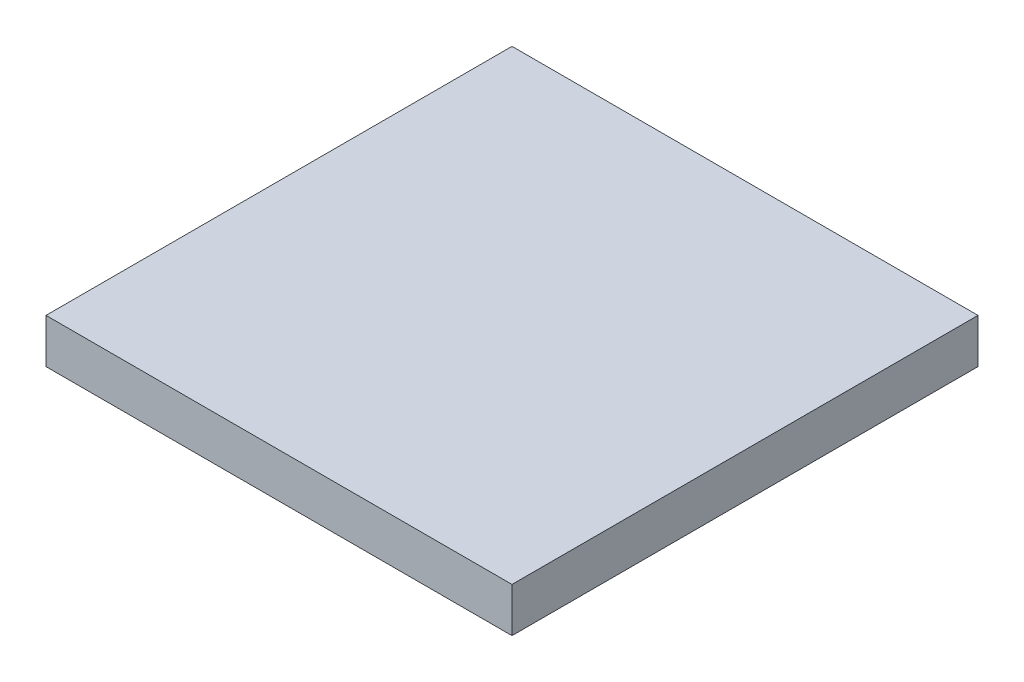
ISO-10303-21;
HEADER;
FILE_DESCRIPTION(('STEP AP214'),'2;1');
FILE_NAME('part.step','',(''),(''),'','','');
FILE_SCHEMA(('AUTOMOTIVE_DESIGN { 1 0 10303 214 1 1 1 1 }'));
ENDSEC;
DATA;
#1=APPLICATION_CONTEXT('core data for automotive mechanical design processes');
#2=APPLICATION_PROTOCOL_DEFINITION('international standard','automotive_design',2000,#1);
#3=PRODUCT_CONTEXT('',#1,'mechanical');
#4=PRODUCT('Part','Part','',(#3));
#5=PRODUCT_RELATED_PRODUCT_CATEGORY('part','',(#4));
#6=PRODUCT_DEFINITION_FORMATION('','',#4);
#7=PRODUCT_DEFINITION_CONTEXT('part definition',#1,'design');
#8=PRODUCT_DEFINITION('design','',#6,#7);
#9=PRODUCT_DEFINITION_SHAPE('','',#8);
#10=(LENGTH_UNIT() NAMED_UNIT(*) SI_UNIT(.MILLI.,.METRE.));
#11=(NAMED_UNIT(*) PLANE_ANGLE_UNIT() SI_UNIT($,.RADIAN.));
#12=(NAMED_UNIT(*) SI_UNIT($,.STERADIAN.) SOLID_ANGLE_UNIT());
#13=UNCERTAINTY_MEASURE_WITH_UNIT(LENGTH_MEASURE(1.E-05),#10,'distance_accuracy_value','');
#14=(GEOMETRIC_REPRESENTATION_CONTEXT(3) GLOBAL_UNCERTAINTY_ASSIGNED_CONTEXT((#13)) GLOBAL_UNIT_ASSIGNED_CONTEXT((#10,
#11,#12)) REPRESENTATION_CONTEXT('',''));
#15=CARTESIAN_POINT('',(0.,0.,0.));
#16=DIRECTION('',(0.,0.,1.));
#17=DIRECTION('',(1.,0.,0.));
#18=AXIS2_PLACEMENT_3D('',#15,#16,#17);
#19=CARTESIAN_POINT('',(50.,150.94635623731,50.));
#20=DIRECTION('',(-1.,0.,0.));
#21=DIRECTION('',(0.,0.,1.));
#22=AXIS2_PLACEMENT_3D('',#19,#20,#21);
#23=PLANE('',#22);
#24=DIRECTION('',(0.,0.,-1.));
#25=VECTOR('',#24,1.);
#26=CARTESIAN_POINT('',(50.,9.52500000000001,50.));
#27=LINE('',#26,#25);
#28=CARTESIAN_POINT('',(50.,9.52500000000001,50.));
#29=VERTEX_POINT('',#28);
#30=CARTESIAN_POINT('',(50.,9.52500000000001,-50.));
#31=VERTEX_POINT('',#30);
#32=EDGE_CURVE('E83',#29,#31,#27,.T.);
#33=ORIENTED_EDGE('',*,*,#32,.F.);
#34=DIRECTION('',(0.,-1.,0.));
#35=VECTOR('',#34,1.);
#36=CARTESIAN_POINT('',(50.,150.94635623731,50.));
#37=LINE('',#36,#35);
#38=CARTESIAN_POINT('',(50.,0.,50.));
#39=VERTEX_POINT('',#38);
#40=EDGE_CURVE('E37',#29,#39,#37,.T.);
#41=ORIENTED_EDGE('',*,*,#40,.T.);
#42=DIRECTION('',(0.,0.,-1.));
#43=VECTOR('',#42,1.);
#44=CARTESIAN_POINT('',(50.,0.,50.));
#45=LINE('',#44,#43);
#46=CARTESIAN_POINT('',(50.,0.,-50.));
#47=VERTEX_POINT('',#46);
#48=EDGE_CURVE('E81',#39,#47,#45,.T.);
#49=ORIENTED_EDGE('',*,*,#48,.T.);
#50=DIRECTION('',(0.,-1.,0.));
#51=VECTOR('',#50,1.);
#52=CARTESIAN_POINT('',(50.,150.94635623731,-50.));
#53=LINE('',#52,#51);
#54=EDGE_CURVE('E72',#31,#47,#53,.T.);
#55=ORIENTED_EDGE('',*,*,#54,.F.);
#56=EDGE_LOOP('',(#33,#41,#49,#55));
#57=FACE_BOUND('',#56,.T.);
#58=ADVANCED_FACE('F33',(#57),#23,.F.);
#59=CARTESIAN_POINT('',(-50.,150.94635623731,-50.));
#60=DIRECTION('',(0.,0.,1.));
#61=DIRECTION('',(1.,0.,0.));
#62=AXIS2_PLACEMENT_3D('',#59,#60,#61);
#63=PLANE('',#62);
#64=DIRECTION('',(-1.,0.,0.));
#65=VECTOR('',#64,1.);
#66=CARTESIAN_POINT('',(-50.,9.52500000000001,-50.));
#67=LINE('',#66,#65);
#68=CARTESIAN_POINT('',(-50.,9.52500000000001,-50.));
#69=VERTEX_POINT('',#68);
#70=EDGE_CURVE('E42',#31,#69,#67,.T.);
#71=ORIENTED_EDGE('',*,*,#70,.F.);
#72=ORIENTED_EDGE('',*,*,#54,.T.);
#73=DIRECTION('',(-1.,0.,0.));
#74=VECTOR('',#73,1.);
#75=CARTESIAN_POINT('',(-50.,0.,-50.));
#76=LINE('',#75,#74);
#77=CARTESIAN_POINT('',(-50.,0.,-50.));
#78=VERTEX_POINT('',#77);
#79=EDGE_CURVE('E93',#47,#78,#76,.T.);
#80=ORIENTED_EDGE('',*,*,#79,.T.);
#81=DIRECTION('',(0.,-1.,0.));
#82=VECTOR('',#81,1.);
#83=CARTESIAN_POINT('',(-50.,150.94635623731,-50.));
#84=LINE('',#83,#82);
#85=EDGE_CURVE('E102',#69,#78,#84,.T.);
#86=ORIENTED_EDGE('',*,*,#85,.F.);
#87=EDGE_LOOP('',(#71,#72,#80,#86));
#88=FACE_BOUND('',#87,.T.);
#89=ADVANCED_FACE('F106',(#88),#63,.F.);
#90=CARTESIAN_POINT('',(-50.,150.94635623731,50.));
#91=DIRECTION('',(1.,0.,0.));
#92=DIRECTION('',(0.,0.,-1.));
#93=AXIS2_PLACEMENT_3D('',#90,#91,#92);
#94=PLANE('',#93);
#95=DIRECTION('',(0.,0.,1.));
#96=VECTOR('',#95,1.);
#97=CARTESIAN_POINT('',(-50.,9.52500000000001,50.));
#98=LINE('',#97,#96);
#99=CARTESIAN_POINT('',(-50.,9.52500000000001,50.));
#100=VERTEX_POINT('',#99);
#101=EDGE_CURVE('E11',#69,#100,#98,.T.);
#102=ORIENTED_EDGE('',*,*,#101,.F.);
#103=ORIENTED_EDGE('',*,*,#85,.T.);
#104=DIRECTION('',(0.,0.,1.));
#105=VECTOR('',#104,1.);
#106=CARTESIAN_POINT('',(-50.,0.,50.));
#107=LINE('',#106,#105);
#108=CARTESIAN_POINT('',(-50.,0.,50.));
#109=VERTEX_POINT('',#108);
#110=EDGE_CURVE('E103',#78,#109,#107,.T.);
#111=ORIENTED_EDGE('',*,*,#110,.T.);
#112=DIRECTION('',(0.,-1.,0.));
#113=VECTOR('',#112,1.);
#114=CARTESIAN_POINT('',(-50.,150.94635623731,50.));
#115=LINE('',#114,#113);
#116=EDGE_CURVE('E55',#100,#109,#115,.T.);
#117=ORIENTED_EDGE('',*,*,#116,.F.);
#118=EDGE_LOOP('',(#102,#103,#111,#117));
#119=FACE_BOUND('',#118,.T.);
#120=ADVANCED_FACE('F105',(#119),#94,.F.);
#121=CARTESIAN_POINT('',(-50.,150.94635623731,50.));
#122=DIRECTION('',(0.,0.,-1.));
#123=DIRECTION('',(-1.,0.,0.));
#124=AXIS2_PLACEMENT_3D('',#121,#122,#123);
#125=PLANE('',#124);
#126=DIRECTION('',(1.,0.,0.));
#127=VECTOR('',#126,1.);
#128=CARTESIAN_POINT('',(-50.,9.52500000000001,50.));
#129=LINE('',#128,#127);
#130=EDGE_CURVE('E90',#100,#29,#129,.T.);
#131=ORIENTED_EDGE('',*,*,#130,.F.);
#132=ORIENTED_EDGE('',*,*,#116,.T.);
#133=DIRECTION('',(1.,0.,0.));
#134=VECTOR('',#133,1.);
#135=CARTESIAN_POINT('',(-50.,0.,50.));
#136=LINE('',#135,#134);
#137=EDGE_CURVE('E86',#109,#39,#136,.T.);
#138=ORIENTED_EDGE('',*,*,#137,.T.);
#139=ORIENTED_EDGE('',*,*,#40,.F.);
#140=EDGE_LOOP('',(#131,#132,#138,#139));
#141=FACE_BOUND('',#140,.T.);
#142=ADVANCED_FACE('F87',(#141),#125,.F.);
#143=CARTESIAN_POINT('',(0.,0.,0.));
#144=DIRECTION('',(0.,-1.,0.));
#145=DIRECTION('',(0.,0.,-1.));
#146=AXIS2_PLACEMENT_3D('',#143,#144,#145);
#147=PLANE('',#146);
#148=ORIENTED_EDGE('',*,*,#48,.F.);
#149=ORIENTED_EDGE('',*,*,#137,.F.);
#150=ORIENTED_EDGE('',*,*,#110,.F.);
#151=ORIENTED_EDGE('',*,*,#79,.F.);
#152=EDGE_LOOP('',(#148,#149,#150,#151));
#153=FACE_BOUND('',#152,.T.);
#154=ADVANCED_FACE('F92',(#153),#147,.T.);
#155=CARTESIAN_POINT('',(0.,9.525,0.));
#156=DIRECTION('',(0.,1.,0.));
#157=DIRECTION('',(0.,0.,1.));
#158=AXIS2_PLACEMENT_3D('',#155,#156,#157);
#159=PLANE('',#158);
#160=ORIENTED_EDGE('',*,*,#130,.T.);
#161=ORIENTED_EDGE('',*,*,#32,.T.);
#162=ORIENTED_EDGE('',*,*,#70,.T.);
#163=ORIENTED_EDGE('',*,*,#101,.T.);
#164=EDGE_LOOP('',(#160,#161,#162,#163));
#165=FACE_BOUND('',#164,.T.);
#166=ADVANCED_FACE('F35',(#165),#159,.T.);
#167=CLOSED_SHELL('',(#58,#89,#120,#142,#154,#166));
#168=MANIFOLD_SOLID_BREP('B2',#167);
#169=ADVANCED_BREP_SHAPE_REPRESENTATION('',(#18,#168),#14);
#170=SHAPE_DEFINITION_REPRESENTATION(#9,#169);
ENDSEC;
END-ISO-10303-21;
